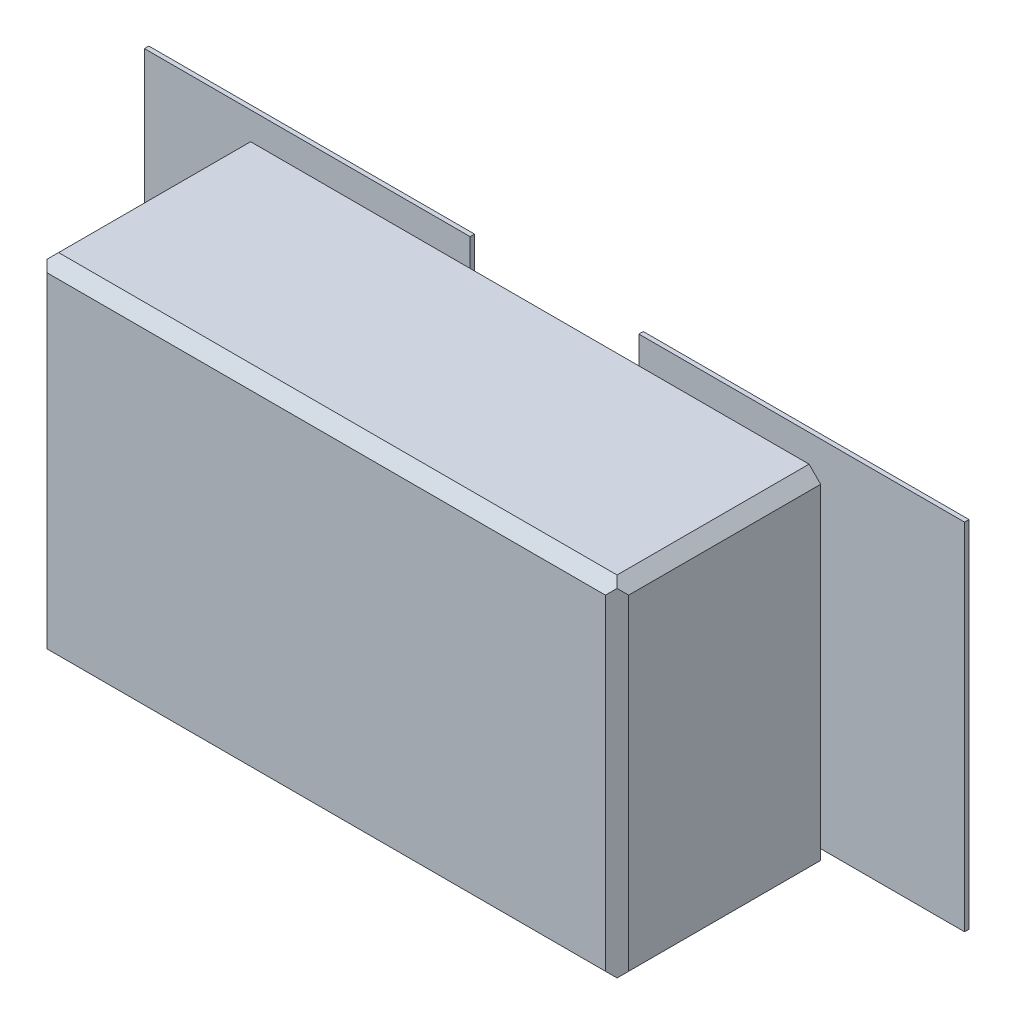
ISO-10303-21;
HEADER;
FILE_DESCRIPTION(('STEP AP214'),'2;1');
FILE_NAME('part.step','',(''),(''),'','','');
FILE_SCHEMA(('AUTOMOTIVE_DESIGN { 1 0 10303 214 1 1 1 1 }'));
ENDSEC;
DATA;
#1=APPLICATION_CONTEXT('core data for automotive mechanical design processes');
#2=APPLICATION_PROTOCOL_DEFINITION('international standard','automotive_design',2000,#1);
#3=PRODUCT_CONTEXT('',#1,'mechanical');
#4=PRODUCT('Part','Part','',(#3));
#5=PRODUCT_RELATED_PRODUCT_CATEGORY('part','',(#4));
#6=PRODUCT_DEFINITION_FORMATION('','',#4);
#7=PRODUCT_DEFINITION_CONTEXT('part definition',#1,'design');
#8=PRODUCT_DEFINITION('design','',#6,#7);
#9=PRODUCT_DEFINITION_SHAPE('','',#8);
#10=(LENGTH_UNIT() NAMED_UNIT(*) SI_UNIT(.MILLI.,.METRE.));
#11=(NAMED_UNIT(*) PLANE_ANGLE_UNIT() SI_UNIT($,.RADIAN.));
#12=(NAMED_UNIT(*) SI_UNIT($,.STERADIAN.) SOLID_ANGLE_UNIT());
#13=UNCERTAINTY_MEASURE_WITH_UNIT(LENGTH_MEASURE(1.E-05),#10,'distance_accuracy_value','');
#14=(GEOMETRIC_REPRESENTATION_CONTEXT(3) GLOBAL_UNCERTAINTY_ASSIGNED_CONTEXT((#13)) GLOBAL_UNIT_ASSIGNED_CONTEXT((#10,
#11,#12)) REPRESENTATION_CONTEXT('',''));
#15=CARTESIAN_POINT('',(0.,0.,0.));
#16=DIRECTION('',(0.,0.,1.));
#17=DIRECTION('',(1.,0.,0.));
#18=AXIS2_PLACEMENT_3D('',#15,#16,#17);
#19=CARTESIAN_POINT('',(0.,0.,0.08382));
#20=DIRECTION('',(0.,0.,1.));
#21=DIRECTION('',(1.,0.,0.));
#22=AXIS2_PLACEMENT_3D('',#19,#20,#21);
#23=PLANE('',#22);
#24=DIRECTION('',(0.,1.,0.));
#25=VECTOR('',#24,1.);
#26=CARTESIAN_POINT('',(0.145000000000004,0.30500000000005,0.08382));
#27=LINE('',#26,#25);
#28=CARTESIAN_POINT('',(0.145000000000004,-0.30500000000005,0.08382));
#29=VERTEX_POINT('',#28);
#30=CARTESIAN_POINT('',(0.145000000000004,0.30500000000005,0.08382));
#31=VERTEX_POINT('',#30);
#32=EDGE_CURVE('P0_E68',#29,#31,#27,.T.);
#33=ORIENTED_EDGE('',*,*,#32,.F.);
#34=DIRECTION('',(1.,0.,0.));
#35=VECTOR('',#34,1.);
#36=CARTESIAN_POINT('',(0.145000000000004,-0.30500000000005,0.08382));
#37=LINE('',#36,#35);
#38=CARTESIAN_POINT('',(0.704999999999974,-0.30500000000005,0.08382));
#39=VERTEX_POINT('',#38);
#40=EDGE_CURVE('P0_E20',#39,#29,#37,.F.);
#41=ORIENTED_EDGE('',*,*,#40,.F.);
#42=DIRECTION('',(0.,1.,0.));
#43=VECTOR('',#42,1.);
#44=CARTESIAN_POINT('',(0.704999999999974,-0.30500000000005,0.08382));
#45=LINE('',#44,#43);
#46=CARTESIAN_POINT('',(0.704999999999974,0.30500000000005,0.08382));
#47=VERTEX_POINT('',#46);
#48=EDGE_CURVE('P0_E58',#47,#39,#45,.F.);
#49=ORIENTED_EDGE('',*,*,#48,.F.);
#50=DIRECTION('',(1.,0.,0.));
#51=VECTOR('',#50,1.);
#52=CARTESIAN_POINT('',(0.704999999999974,0.30500000000005,0.08382));
#53=LINE('',#52,#51);
#54=EDGE_CURVE('P0_E53',#31,#47,#53,.T.);
#55=ORIENTED_EDGE('',*,*,#54,.F.);
#56=EDGE_LOOP('',(#33,#41,#49,#55));
#57=FACE_BOUND('',#56,.T.);
#58=ADVANCED_FACE('P0_F17',(#57),#23,.T.);
#59=CARTESIAN_POINT('',(0.145000000000004,-0.30500000000005,0.0762));
#60=DIRECTION('',(0.,-1.,0.));
#61=DIRECTION('',(0.,0.,-1.));
#62=AXIS2_PLACEMENT_3D('',#59,#60,#61);
#63=PLANE('',#62);
#64=DIRECTION('',(0.,0.,1.));
#65=VECTOR('',#64,1.);
#66=CARTESIAN_POINT('',(0.145000000000004,-0.30500000000005,0.0762));
#67=LINE('',#66,#65);
#68=CARTESIAN_POINT('',(0.145000000000004,-0.30500000000005,0.0762));
#69=VERTEX_POINT('',#68);
#70=EDGE_CURVE('P0_E79',#69,#29,#67,.T.);
#71=ORIENTED_EDGE('',*,*,#70,.F.);
#72=DIRECTION('',(1.,0.,0.));
#73=VECTOR('',#72,1.);
#74=CARTESIAN_POINT('',(0.,-0.30500000000005,0.0762));
#75=LINE('',#74,#73);
#76=CARTESIAN_POINT('',(0.704999999999974,-0.30500000000005,0.0762));
#77=VERTEX_POINT('',#76);
#78=EDGE_CURVE('P0_E74',#69,#77,#75,.T.);
#79=ORIENTED_EDGE('',*,*,#78,.T.);
#80=DIRECTION('',(0.,0.,-1.));
#81=VECTOR('',#80,1.);
#82=CARTESIAN_POINT('',(0.704999999999974,-0.30500000000005,0.0762));
#83=LINE('',#82,#81);
#84=EDGE_CURVE('P0_E63',#39,#77,#83,.T.);
#85=ORIENTED_EDGE('',*,*,#84,.F.);
#86=ORIENTED_EDGE('',*,*,#40,.T.);
#87=EDGE_LOOP('',(#71,#79,#85,#86));
#88=FACE_BOUND('',#87,.T.);
#89=ADVANCED_FACE('P0_F73',(#88),#63,.T.);
#90=CARTESIAN_POINT('',(0.704999999999974,-0.30500000000005,0.0762));
#91=DIRECTION('',(1.,0.,0.));
#92=DIRECTION('',(0.,0.,-1.));
#93=AXIS2_PLACEMENT_3D('',#90,#91,#92);
#94=PLANE('',#93);
#95=ORIENTED_EDGE('',*,*,#84,.T.);
#96=DIRECTION('',(0.,1.,0.));
#97=VECTOR('',#96,1.);
#98=CARTESIAN_POINT('',(0.704999999999974,0.,0.0762));
#99=LINE('',#98,#97);
#100=CARTESIAN_POINT('',(0.704999999999974,0.30500000000005,0.0762));
#101=VERTEX_POINT('',#100);
#102=EDGE_CURVE('P0_E84',#77,#101,#99,.T.);
#103=ORIENTED_EDGE('',*,*,#102,.T.);
#104=DIRECTION('',(0.,0.,1.));
#105=VECTOR('',#104,1.);
#106=CARTESIAN_POINT('',(0.704999999999974,0.30500000000005,0.0762));
#107=LINE('',#106,#105);
#108=EDGE_CURVE('P0_E65',#47,#101,#107,.F.);
#109=ORIENTED_EDGE('',*,*,#108,.F.);
#110=ORIENTED_EDGE('',*,*,#48,.T.);
#111=EDGE_LOOP('',(#95,#103,#109,#110));
#112=FACE_BOUND('',#111,.T.);
#113=ADVANCED_FACE('P0_F60',(#112),#94,.T.);
#114=CARTESIAN_POINT('',(0.704999999999974,0.30500000000005,0.0762));
#115=DIRECTION('',(0.,1.,0.));
#116=DIRECTION('',(0.,0.,1.));
#117=AXIS2_PLACEMENT_3D('',#114,#115,#116);
#118=PLANE('',#117);
#119=ORIENTED_EDGE('',*,*,#108,.T.);
#120=DIRECTION('',(1.,0.,0.));
#121=VECTOR('',#120,1.);
#122=CARTESIAN_POINT('',(0.,0.30500000000005,0.0762));
#123=LINE('',#122,#121);
#124=CARTESIAN_POINT('',(0.145000000000004,0.30500000000005,0.0762));
#125=VERTEX_POINT('',#124);
#126=EDGE_CURVE('P0_E26',#101,#125,#123,.F.);
#127=ORIENTED_EDGE('',*,*,#126,.T.);
#128=DIRECTION('',(0.,0.,1.));
#129=VECTOR('',#128,1.);
#130=CARTESIAN_POINT('',(0.145000000000004,0.30500000000005,0.0762));
#131=LINE('',#130,#129);
#132=EDGE_CURVE('P0_E34',#31,#125,#131,.F.);
#133=ORIENTED_EDGE('',*,*,#132,.F.);
#134=ORIENTED_EDGE('',*,*,#54,.T.);
#135=EDGE_LOOP('',(#119,#127,#133,#134));
#136=FACE_BOUND('',#135,.T.);
#137=ADVANCED_FACE('P0_F88',(#136),#118,.T.);
#138=CARTESIAN_POINT('',(0.145000000000004,0.30500000000005,0.0762));
#139=DIRECTION('',(-1.,0.,0.));
#140=DIRECTION('',(0.,0.,1.));
#141=AXIS2_PLACEMENT_3D('',#138,#139,#140);
#142=PLANE('',#141);
#143=ORIENTED_EDGE('',*,*,#132,.T.);
#144=DIRECTION('',(0.,1.,0.));
#145=VECTOR('',#144,1.);
#146=CARTESIAN_POINT('',(0.145000000000004,0.,0.0762));
#147=LINE('',#146,#145);
#148=EDGE_CURVE('P0_E11',#125,#69,#147,.F.);
#149=ORIENTED_EDGE('',*,*,#148,.T.);
#150=ORIENTED_EDGE('',*,*,#70,.T.);
#151=ORIENTED_EDGE('',*,*,#32,.T.);
#152=EDGE_LOOP('',(#143,#149,#150,#151));
#153=FACE_BOUND('',#152,.T.);
#154=ADVANCED_FACE('P0_F91',(#153),#142,.T.);
#155=CARTESIAN_POINT('',(0.,0.,0.0762));
#156=DIRECTION('',(0.,0.,1.));
#157=DIRECTION('',(1.,0.,0.));
#158=AXIS2_PLACEMENT_3D('',#155,#156,#157);
#159=PLANE('',#158);
#160=ORIENTED_EDGE('',*,*,#126,.F.);
#161=ORIENTED_EDGE('',*,*,#102,.F.);
#162=ORIENTED_EDGE('',*,*,#78,.F.);
#163=ORIENTED_EDGE('',*,*,#148,.F.);
#164=EDGE_LOOP('',(#160,#161,#162,#163));
#165=FACE_BOUND('',#164,.T.);
#166=ADVANCED_FACE('P0_F90',(#165),#159,.F.);
#167=CLOSED_SHELL('',(#58,#89,#113,#137,#154,#166));
#168=MANIFOLD_SOLID_BREP('P0_B1',#167);
#169=CARTESIAN_POINT('',(0.,0.,0.08382));
#170=DIRECTION('',(0.,0.,1.));
#171=DIRECTION('',(1.,0.,0.));
#172=AXIS2_PLACEMENT_3D('',#169,#170,#171);
#173=PLANE('',#172);
#174=DIRECTION('',(0.,1.,0.));
#175=VECTOR('',#174,1.);
#176=CARTESIAN_POINT('',(-0.704999999999974,0.30500000000005,0.08382));
#177=LINE('',#176,#175);
#178=CARTESIAN_POINT('',(-0.704999999999974,-0.30500000000005,0.08382));
#179=VERTEX_POINT('',#178);
#180=CARTESIAN_POINT('',(-0.704999999999974,0.30500000000005,0.08382));
#181=VERTEX_POINT('',#180);
#182=EDGE_CURVE('P1_E68',#179,#181,#177,.T.);
#183=ORIENTED_EDGE('',*,*,#182,.F.);
#184=DIRECTION('',(1.,0.,0.));
#185=VECTOR('',#184,1.);
#186=CARTESIAN_POINT('',(-0.704999999999974,-0.30500000000005,0.08382));
#187=LINE('',#186,#185);
#188=CARTESIAN_POINT('',(-0.145000000000004,-0.30500000000005,0.08382));
#189=VERTEX_POINT('',#188);
#190=EDGE_CURVE('P1_E20',#189,#179,#187,.F.);
#191=ORIENTED_EDGE('',*,*,#190,.F.);
#192=DIRECTION('',(0.,1.,0.));
#193=VECTOR('',#192,1.);
#194=CARTESIAN_POINT('',(-0.145000000000004,-0.30500000000005,0.08382));
#195=LINE('',#194,#193);
#196=CARTESIAN_POINT('',(-0.145000000000004,0.30500000000005,0.08382));
#197=VERTEX_POINT('',#196);
#198=EDGE_CURVE('P1_E58',#197,#189,#195,.F.);
#199=ORIENTED_EDGE('',*,*,#198,.F.);
#200=DIRECTION('',(1.,0.,0.));
#201=VECTOR('',#200,1.);
#202=CARTESIAN_POINT('',(-0.145000000000004,0.30500000000005,0.08382));
#203=LINE('',#202,#201);
#204=EDGE_CURVE('P1_E53',#181,#197,#203,.T.);
#205=ORIENTED_EDGE('',*,*,#204,.F.);
#206=EDGE_LOOP('',(#183,#191,#199,#205));
#207=FACE_BOUND('',#206,.T.);
#208=ADVANCED_FACE('P1_F17',(#207),#173,.T.);
#209=CARTESIAN_POINT('',(-0.704999999999974,-0.30500000000005,0.0762));
#210=DIRECTION('',(0.,-1.,0.));
#211=DIRECTION('',(0.,0.,-1.));
#212=AXIS2_PLACEMENT_3D('',#209,#210,#211);
#213=PLANE('',#212);
#214=DIRECTION('',(0.,0.,1.));
#215=VECTOR('',#214,1.);
#216=CARTESIAN_POINT('',(-0.704999999999974,-0.30500000000005,0.0762));
#217=LINE('',#216,#215);
#218=CARTESIAN_POINT('',(-0.704999999999974,-0.30500000000005,0.0762));
#219=VERTEX_POINT('',#218);
#220=EDGE_CURVE('P1_E79',#219,#179,#217,.T.);
#221=ORIENTED_EDGE('',*,*,#220,.F.);
#222=DIRECTION('',(1.,0.,0.));
#223=VECTOR('',#222,1.);
#224=CARTESIAN_POINT('',(0.,-0.30500000000005,0.0762));
#225=LINE('',#224,#223);
#226=CARTESIAN_POINT('',(-0.145000000000004,-0.30500000000005,0.0762));
#227=VERTEX_POINT('',#226);
#228=EDGE_CURVE('P1_E74',#219,#227,#225,.T.);
#229=ORIENTED_EDGE('',*,*,#228,.T.);
#230=DIRECTION('',(0.,0.,-1.));
#231=VECTOR('',#230,1.);
#232=CARTESIAN_POINT('',(-0.145000000000004,-0.30500000000005,0.0762));
#233=LINE('',#232,#231);
#234=EDGE_CURVE('P1_E63',#189,#227,#233,.T.);
#235=ORIENTED_EDGE('',*,*,#234,.F.);
#236=ORIENTED_EDGE('',*,*,#190,.T.);
#237=EDGE_LOOP('',(#221,#229,#235,#236));
#238=FACE_BOUND('',#237,.T.);
#239=ADVANCED_FACE('P1_F73',(#238),#213,.T.);
#240=CARTESIAN_POINT('',(-0.145000000000004,-0.30500000000005,0.0762));
#241=DIRECTION('',(1.,0.,0.));
#242=DIRECTION('',(0.,0.,-1.));
#243=AXIS2_PLACEMENT_3D('',#240,#241,#242);
#244=PLANE('',#243);
#245=ORIENTED_EDGE('',*,*,#234,.T.);
#246=DIRECTION('',(0.,1.,0.));
#247=VECTOR('',#246,1.);
#248=CARTESIAN_POINT('',(-0.145000000000004,0.,0.0762));
#249=LINE('',#248,#247);
#250=CARTESIAN_POINT('',(-0.145000000000004,0.30500000000005,0.0762));
#251=VERTEX_POINT('',#250);
#252=EDGE_CURVE('P1_E84',#227,#251,#249,.T.);
#253=ORIENTED_EDGE('',*,*,#252,.T.);
#254=DIRECTION('',(0.,0.,1.));
#255=VECTOR('',#254,1.);
#256=CARTESIAN_POINT('',(-0.145000000000004,0.30500000000005,0.0762));
#257=LINE('',#256,#255);
#258=EDGE_CURVE('P1_E65',#197,#251,#257,.F.);
#259=ORIENTED_EDGE('',*,*,#258,.F.);
#260=ORIENTED_EDGE('',*,*,#198,.T.);
#261=EDGE_LOOP('',(#245,#253,#259,#260));
#262=FACE_BOUND('',#261,.T.);
#263=ADVANCED_FACE('P1_F60',(#262),#244,.T.);
#264=CARTESIAN_POINT('',(-0.145000000000004,0.30500000000005,0.0762));
#265=DIRECTION('',(0.,1.,0.));
#266=DIRECTION('',(0.,0.,1.));
#267=AXIS2_PLACEMENT_3D('',#264,#265,#266);
#268=PLANE('',#267);
#269=ORIENTED_EDGE('',*,*,#258,.T.);
#270=DIRECTION('',(1.,0.,0.));
#271=VECTOR('',#270,1.);
#272=CARTESIAN_POINT('',(0.,0.30500000000005,0.0762));
#273=LINE('',#272,#271);
#274=CARTESIAN_POINT('',(-0.704999999999974,0.30500000000005,0.0762));
#275=VERTEX_POINT('',#274);
#276=EDGE_CURVE('P1_E26',#251,#275,#273,.F.);
#277=ORIENTED_EDGE('',*,*,#276,.T.);
#278=DIRECTION('',(0.,0.,1.));
#279=VECTOR('',#278,1.);
#280=CARTESIAN_POINT('',(-0.704999999999974,0.30500000000005,0.0762));
#281=LINE('',#280,#279);
#282=EDGE_CURVE('P1_E34',#181,#275,#281,.F.);
#283=ORIENTED_EDGE('',*,*,#282,.F.);
#284=ORIENTED_EDGE('',*,*,#204,.T.);
#285=EDGE_LOOP('',(#269,#277,#283,#284));
#286=FACE_BOUND('',#285,.T.);
#287=ADVANCED_FACE('P1_F88',(#286),#268,.T.);
#288=CARTESIAN_POINT('',(-0.704999999999974,0.30500000000005,0.0762));
#289=DIRECTION('',(-1.,0.,0.));
#290=DIRECTION('',(0.,0.,1.));
#291=AXIS2_PLACEMENT_3D('',#288,#289,#290);
#292=PLANE('',#291);
#293=ORIENTED_EDGE('',*,*,#282,.T.);
#294=DIRECTION('',(0.,1.,0.));
#295=VECTOR('',#294,1.);
#296=CARTESIAN_POINT('',(-0.704999999999974,0.,0.0762));
#297=LINE('',#296,#295);
#298=EDGE_CURVE('P1_E11',#275,#219,#297,.F.);
#299=ORIENTED_EDGE('',*,*,#298,.T.);
#300=ORIENTED_EDGE('',*,*,#220,.T.);
#301=ORIENTED_EDGE('',*,*,#182,.T.);
#302=EDGE_LOOP('',(#293,#299,#300,#301));
#303=FACE_BOUND('',#302,.T.);
#304=ADVANCED_FACE('P1_F91',(#303),#292,.T.);
#305=CARTESIAN_POINT('',(0.,0.,0.0762));
#306=DIRECTION('',(0.,0.,1.));
#307=DIRECTION('',(1.,0.,0.));
#308=AXIS2_PLACEMENT_3D('',#305,#306,#307);
#309=PLANE('',#308);
#310=ORIENTED_EDGE('',*,*,#276,.F.);
#311=ORIENTED_EDGE('',*,*,#252,.F.);
#312=ORIENTED_EDGE('',*,*,#228,.F.);
#313=ORIENTED_EDGE('',*,*,#298,.F.);
#314=EDGE_LOOP('',(#310,#311,#312,#313));
#315=FACE_BOUND('',#314,.T.);
#316=ADVANCED_FACE('P1_F90',(#315),#309,.F.);
#317=CLOSED_SHELL('',(#208,#239,#263,#287,#304,#316));
#318=MANIFOLD_SOLID_BREP('P1_B1',#317);
#319=CARTESIAN_POINT('',(0.,0.,0.0862000000000108));
#320=DIRECTION('',(0.,0.,-1.));
#321=DIRECTION('',(-1.,0.,0.));
#322=AXIS2_PLACEMENT_3D('',#319,#320,#321);
#323=PLANE('',#322);
#324=DIRECTION('',(1.,0.,0.));
#325=VECTOR('',#324,1.);
#326=CARTESIAN_POINT('',(-0.415997395786882,0.249999999999991,0.0862000000000108));
#327=LINE('',#326,#325);
#328=CARTESIAN_POINT('',(-0.215997395786768,0.249999999999991,0.0862000000000108));
#329=VERTEX_POINT('',#328);
#330=CARTESIAN_POINT('',(-0.41599739578678,0.249999999999991,0.0862000000000108));
#331=VERTEX_POINT('',#330);
#332=EDGE_CURVE('P2_E184',#329,#331,#327,.F.);
#333=ORIENTED_EDGE('',*,*,#332,.F.);
#334=DIRECTION('',(0.,1.,0.));
#335=VECTOR('',#334,1.);
#336=CARTESIAN_POINT('',(-0.215997395786768,0.249999999999991,0.0862000000000108));
#337=LINE('',#336,#335);
#338=CARTESIAN_POINT('',(-0.215997395786768,-0.249999999999991,0.0862000000000108));
#339=VERTEX_POINT('',#338);
#340=EDGE_CURVE('P2_E212',#339,#329,#337,.T.);
#341=ORIENTED_EDGE('',*,*,#340,.F.);
#342=DIRECTION('',(1.,0.,0.));
#343=VECTOR('',#342,1.);
#344=CARTESIAN_POINT('',(-0.215997395786768,-0.249999999999991,0.0862000000000108));
#345=LINE('',#344,#343);
#346=CARTESIAN_POINT('',(-0.465997395786682,-0.249999999999991,0.0862000000000108));
#347=VERTEX_POINT('',#346);
#348=EDGE_CURVE('P2_E163',#347,#339,#345,.T.);
#349=ORIENTED_EDGE('',*,*,#348,.F.);
#350=DIRECTION('',(0.,1.,0.));
#351=VECTOR('',#350,1.);
#352=CARTESIAN_POINT('',(-0.465997395786682,-0.249999999999991,0.0862000000000108));
#353=LINE('',#352,#351);
#354=CARTESIAN_POINT('',(-0.465997395786682,0.199999999999987,0.0862000000000108));
#355=VERTEX_POINT('',#354);
#356=EDGE_CURVE('P2_E157',#355,#347,#353,.F.);
#357=ORIENTED_EDGE('',*,*,#356,.F.);
#358=CARTESIAN_POINT('',(-0.465997395786682,0.249999999999991,0.0862000000000108));
#359=DIRECTION('',(0.,0.,-1.));
#360=DIRECTION('',(-1.,0.,0.));
#361=AXIS2_PLACEMENT_3D('',#358,#359,#360);
#362=CIRCLE('',#361,0.0500000000000032);
#363=EDGE_CURVE('P2_E20',#355,#331,#362,.F.);
#364=ORIENTED_EDGE('',*,*,#363,.T.);
#365=EDGE_LOOP('',(#333,#341,#349,#357,#364));
#366=FACE_BOUND('',#365,.T.);
#367=ADVANCED_FACE('P2_F17',(#366),#323,.T.);
#368=CARTESIAN_POINT('',(0.,0.,0.0862000000000108));
#369=DIRECTION('',(0.,0.,-1.));
#370=DIRECTION('',(-1.,0.,0.));
#371=AXIS2_PLACEMENT_3D('',#368,#369,#370);
#372=PLANE('',#371);
#373=DIRECTION('',(1.,0.,0.));
#374=VECTOR('',#373,1.);
#375=CARTESIAN_POINT('',(0.184002604213233,0.249999999999991,0.0862000000000108));
#376=LINE('',#375,#374);
#377=CARTESIAN_POINT('',(0.434002604213274,0.249999999999991,0.0862000000000108));
#378=VERTEX_POINT('',#377);
#379=CARTESIAN_POINT('',(0.184002604213233,0.249999999999991,0.0862000000000108));
#380=VERTEX_POINT('',#379);
#381=EDGE_CURVE('P2_E232',#378,#380,#376,.F.);
#382=ORIENTED_EDGE('',*,*,#381,.F.);
#383=DIRECTION('',(0.,1.,0.));
#384=VECTOR('',#383,1.);
#385=CARTESIAN_POINT('',(0.434002604213274,0.249999999999991,0.0862000000000108));
#386=LINE('',#385,#384);
#387=CARTESIAN_POINT('',(0.434002604213274,-0.249999999999991,0.0862000000000108));
#388=VERTEX_POINT('',#387);
#389=EDGE_CURVE('P2_E249',#388,#378,#386,.T.);
#390=ORIENTED_EDGE('',*,*,#389,.F.);
#391=DIRECTION('',(1.,0.,0.));
#392=VECTOR('',#391,1.);
#393=CARTESIAN_POINT('',(0.434002604213274,-0.249999999999991,0.0862000000000108));
#394=LINE('',#393,#392);
#395=CARTESIAN_POINT('',(0.184002604213233,-0.249999999999991,0.0862000000000108));
#396=VERTEX_POINT('',#395);
#397=EDGE_CURVE('P2_E247',#396,#388,#394,.T.);
#398=ORIENTED_EDGE('',*,*,#397,.F.);
#399=DIRECTION('',(0.,1.,0.));
#400=VECTOR('',#399,1.);
#401=CARTESIAN_POINT('',(0.184002604213233,-0.249999999999991,0.0862000000000108));
#402=LINE('',#401,#400);
#403=EDGE_CURVE('P2_E241',#380,#396,#402,.F.);
#404=ORIENTED_EDGE('',*,*,#403,.F.);
#405=EDGE_LOOP('',(#382,#390,#398,#404));
#406=FACE_BOUND('',#405,.T.);
#407=ADVANCED_FACE('P2_F273',(#406),#372,.T.);
#408=CARTESIAN_POINT('',(-0.215997395786768,0.249999999999991,0.126200000000003));
#409=DIRECTION('',(1.,0.,0.));
#410=DIRECTION('',(0.,0.,-1.));
#411=AXIS2_PLACEMENT_3D('',#408,#409,#410);
#412=PLANE('',#411);
#413=DIRECTION('',(0.,0.,1.));
#414=VECTOR('',#413,1.);
#415=CARTESIAN_POINT('',(-0.215997395786768,0.249999999999991,0.126200000000003));
#416=LINE('',#415,#414);
#417=CARTESIAN_POINT('',(-0.215997395786768,0.249999999999991,0.126200000000003));
#418=VERTEX_POINT('',#417);
#419=EDGE_CURVE('P2_E182',#418,#329,#416,.F.);
#420=ORIENTED_EDGE('',*,*,#419,.F.);
#421=DIRECTION('',(0.,1.,0.));
#422=VECTOR('',#421,1.);
#423=CARTESIAN_POINT('',(-0.215997395786768,0.,0.126200000000003));
#424=LINE('',#423,#422);
#425=CARTESIAN_POINT('',(-0.215997395786768,-0.249999999999991,0.126200000000003));
#426=VERTEX_POINT('',#425);
#427=EDGE_CURVE('P2_E194',#418,#426,#424,.F.);
#428=ORIENTED_EDGE('',*,*,#427,.T.);
#429=DIRECTION('',(0.,0.,-1.));
#430=VECTOR('',#429,1.);
#431=CARTESIAN_POINT('',(-0.215997395786768,-0.249999999999991,0.126200000000003));
#432=LINE('',#431,#430);
#433=EDGE_CURVE('P2_E168',#339,#426,#432,.F.);
#434=ORIENTED_EDGE('',*,*,#433,.F.);
#435=ORIENTED_EDGE('',*,*,#340,.T.);
#436=EDGE_LOOP('',(#420,#428,#434,#435));
#437=FACE_BOUND('',#436,.T.);
#438=ADVANCED_FACE('P2_F262',(#437),#412,.T.);
#439=CARTESIAN_POINT('',(-0.215997395786768,-0.249999999999991,0.126200000000003));
#440=DIRECTION('',(0.,-1.,0.));
#441=DIRECTION('',(0.,0.,-1.));
#442=AXIS2_PLACEMENT_3D('',#439,#440,#441);
#443=PLANE('',#442);
#444=ORIENTED_EDGE('',*,*,#433,.T.);
#445=DIRECTION('',(1.,0.,0.));
#446=VECTOR('',#445,1.);
#447=CARTESIAN_POINT('',(0.,-0.249999999999991,0.126200000000003));
#448=LINE('',#447,#446);
#449=CARTESIAN_POINT('',(-0.465997395786682,-0.249999999999991,0.126200000000003));
#450=VERTEX_POINT('',#449);
#451=EDGE_CURVE('P2_E196',#426,#450,#448,.F.);
#452=ORIENTED_EDGE('',*,*,#451,.T.);
#453=DIRECTION('',(0.,0.,1.));
#454=VECTOR('',#453,1.);
#455=CARTESIAN_POINT('',(-0.465997395786682,-0.249999999999991,0.126200000000003));
#456=LINE('',#455,#454);
#457=EDGE_CURVE('P2_E167',#347,#450,#456,.T.);
#458=ORIENTED_EDGE('',*,*,#457,.F.);
#459=ORIENTED_EDGE('',*,*,#348,.T.);
#460=EDGE_LOOP('',(#444,#452,#458,#459));
#461=FACE_BOUND('',#460,.T.);
#462=ADVANCED_FACE('P2_F264',(#461),#443,.T.);
#463=CARTESIAN_POINT('',(-0.465997395786682,-0.249999999999991,0.126200000000003));
#464=DIRECTION('',(-1.,0.,0.));
#465=DIRECTION('',(0.,0.,1.));
#466=AXIS2_PLACEMENT_3D('',#463,#464,#465);
#467=PLANE('',#466);
#468=ORIENTED_EDGE('',*,*,#457,.T.);
#469=DIRECTION('',(0.,1.,0.));
#470=VECTOR('',#469,1.);
#471=CARTESIAN_POINT('',(-0.465997395786682,0.,0.126200000000003));
#472=LINE('',#471,#470);
#473=CARTESIAN_POINT('',(-0.465997395786682,0.199999999999987,0.126200000000003));
#474=VERTEX_POINT('',#473);
#475=EDGE_CURVE('P2_E174',#450,#474,#472,.T.);
#476=ORIENTED_EDGE('',*,*,#475,.T.);
#477=DIRECTION('',(0.,0.,-1.));
#478=VECTOR('',#477,1.);
#479=CARTESIAN_POINT('',(-0.465997395786682,0.199999999999987,0.126200000000003));
#480=LINE('',#479,#478);
#481=EDGE_CURVE('P2_E171',#474,#355,#480,.T.);
#482=ORIENTED_EDGE('',*,*,#481,.T.);
#483=ORIENTED_EDGE('',*,*,#356,.T.);
#484=EDGE_LOOP('',(#468,#476,#482,#483));
#485=FACE_BOUND('',#484,.T.);
#486=ADVANCED_FACE('P2_F172',(#485),#467,.T.);
#487=CARTESIAN_POINT('',(-0.465997395786682,0.249999999999991,0.126200000000003));
#488=DIRECTION('',(0.,0.,-1.));
#489=DIRECTION('',(-1.,0.,0.));
#490=AXIS2_PLACEMENT_3D('',#487,#488,#489);
#491=CYLINDRICAL_SURFACE('',#490,0.0500000000000032);
#492=ORIENTED_EDGE('',*,*,#363,.F.);
#493=ORIENTED_EDGE('',*,*,#481,.F.);
#494=CARTESIAN_POINT('',(-0.465997395786682,0.249999999999991,0.126200000000003));
#495=DIRECTION('',(0.,0.,-1.));
#496=DIRECTION('',(-1.,0.,0.));
#497=AXIS2_PLACEMENT_3D('',#494,#495,#496);
#498=CIRCLE('',#497,0.0500000000000032);
#499=CARTESIAN_POINT('',(-0.41599739578678,0.249999999999991,0.126200000000003));
#500=VERTEX_POINT('',#499);
#501=EDGE_CURVE('P2_E220',#474,#500,#498,.F.);
#502=ORIENTED_EDGE('',*,*,#501,.T.);
#503=DIRECTION('',(0.,0.,1.));
#504=VECTOR('',#503,1.);
#505=CARTESIAN_POINT('',(-0.415997395786882,0.249999999999991,0.126200000000003));
#506=LINE('',#505,#504);
#507=EDGE_CURVE('P2_E180',#331,#500,#506,.T.);
#508=ORIENTED_EDGE('',*,*,#507,.F.);
#509=EDGE_LOOP('',(#492,#493,#502,#508));
#510=FACE_BOUND('',#509,.T.);
#511=ADVANCED_FACE('P2_F178',(#510),#491,.F.);
#512=CARTESIAN_POINT('',(-0.415997395786882,0.249999999999991,0.126200000000003));
#513=DIRECTION('',(0.,1.,0.));
#514=DIRECTION('',(0.,0.,1.));
#515=AXIS2_PLACEMENT_3D('',#512,#513,#514);
#516=PLANE('',#515);
#517=ORIENTED_EDGE('',*,*,#507,.T.);
#518=DIRECTION('',(1.,0.,0.));
#519=VECTOR('',#518,1.);
#520=CARTESIAN_POINT('',(0.,0.249999999999991,0.126200000000003));
#521=LINE('',#520,#519);
#522=EDGE_CURVE('P2_E221',#500,#418,#521,.T.);
#523=ORIENTED_EDGE('',*,*,#522,.T.);
#524=ORIENTED_EDGE('',*,*,#419,.T.);
#525=ORIENTED_EDGE('',*,*,#332,.T.);
#526=EDGE_LOOP('',(#517,#523,#524,#525));
#527=FACE_BOUND('',#526,.T.);
#528=ADVANCED_FACE('P2_F254',(#527),#516,.T.);
#529=CARTESIAN_POINT('',(0.434002604213274,0.249999999999991,0.126200000000003));
#530=DIRECTION('',(1.,0.,0.));
#531=DIRECTION('',(0.,0.,-1.));
#532=AXIS2_PLACEMENT_3D('',#529,#530,#531);
#533=PLANE('',#532);
#534=DIRECTION('',(0.,0.,1.));
#535=VECTOR('',#534,1.);
#536=CARTESIAN_POINT('',(0.434002604213274,0.249999999999991,0.126200000000003));
#537=LINE('',#536,#535);
#538=CARTESIAN_POINT('',(0.434002604213274,0.249999999999991,0.126200000000003));
#539=VERTEX_POINT('',#538);
#540=EDGE_CURVE('P2_E235',#539,#378,#537,.F.);
#541=ORIENTED_EDGE('',*,*,#540,.F.);
#542=DIRECTION('',(0.,1.,0.));
#543=VECTOR('',#542,1.);
#544=CARTESIAN_POINT('',(0.434002604213274,0.,0.126200000000003));
#545=LINE('',#544,#543);
#546=CARTESIAN_POINT('',(0.434002604213274,-0.249999999999991,0.126200000000003));
#547=VERTEX_POINT('',#546);
#548=EDGE_CURVE('P2_E222',#539,#547,#545,.F.);
#549=ORIENTED_EDGE('',*,*,#548,.T.);
#550=DIRECTION('',(0.,0.,-1.));
#551=VECTOR('',#550,1.);
#552=CARTESIAN_POINT('',(0.434002604213274,-0.249999999999991,0.126200000000003));
#553=LINE('',#552,#551);
#554=EDGE_CURVE('P2_E244',#388,#547,#553,.F.);
#555=ORIENTED_EDGE('',*,*,#554,.F.);
#556=ORIENTED_EDGE('',*,*,#389,.T.);
#557=EDGE_LOOP('',(#541,#549,#555,#556));
#558=FACE_BOUND('',#557,.T.);
#559=ADVANCED_FACE('P2_F344',(#558),#533,.T.);
#560=CARTESIAN_POINT('',(0.434002604213274,-0.249999999999991,0.126200000000003));
#561=DIRECTION('',(0.,-1.,0.));
#562=DIRECTION('',(0.,0.,-1.));
#563=AXIS2_PLACEMENT_3D('',#560,#561,#562);
#564=PLANE('',#563);
#565=ORIENTED_EDGE('',*,*,#554,.T.);
#566=DIRECTION('',(1.,0.,0.));
#567=VECTOR('',#566,1.);
#568=CARTESIAN_POINT('',(0.,-0.249999999999991,0.126200000000003));
#569=LINE('',#568,#567);
#570=CARTESIAN_POINT('',(0.184002604213233,-0.249999999999991,0.126200000000003));
#571=VERTEX_POINT('',#570);
#572=EDGE_CURVE('P2_E513',#547,#571,#569,.F.);
#573=ORIENTED_EDGE('',*,*,#572,.T.);
#574=DIRECTION('',(0.,0.,1.));
#575=VECTOR('',#574,1.);
#576=CARTESIAN_POINT('',(0.184002604213233,-0.249999999999991,0.126200000000003));
#577=LINE('',#576,#575);
#578=EDGE_CURVE('P2_E238',#396,#571,#577,.T.);
#579=ORIENTED_EDGE('',*,*,#578,.F.);
#580=ORIENTED_EDGE('',*,*,#397,.T.);
#581=EDGE_LOOP('',(#565,#573,#579,#580));
#582=FACE_BOUND('',#581,.T.);
#583=ADVANCED_FACE('P2_F340',(#582),#564,.T.);
#584=CARTESIAN_POINT('',(0.184002604213233,-0.249999999999991,0.126200000000003));
#585=DIRECTION('',(-1.,0.,0.));
#586=DIRECTION('',(0.,0.,1.));
#587=AXIS2_PLACEMENT_3D('',#584,#585,#586);
#588=PLANE('',#587);
#589=ORIENTED_EDGE('',*,*,#578,.T.);
#590=DIRECTION('',(0.,1.,0.));
#591=VECTOR('',#590,1.);
#592=CARTESIAN_POINT('',(0.184002604213233,0.,0.126200000000003));
#593=LINE('',#592,#591);
#594=CARTESIAN_POINT('',(0.184002604213233,0.249999999999991,0.126200000000003));
#595=VERTEX_POINT('',#594);
#596=EDGE_CURVE('P2_E517',#571,#595,#593,.T.);
#597=ORIENTED_EDGE('',*,*,#596,.T.);
#598=DIRECTION('',(0.,0.,1.));
#599=VECTOR('',#598,1.);
#600=CARTESIAN_POINT('',(0.184002604213233,0.249999999999991,0.126200000000003));
#601=LINE('',#600,#599);
#602=EDGE_CURVE('P2_E197',#380,#595,#601,.T.);
#603=ORIENTED_EDGE('',*,*,#602,.F.);
#604=ORIENTED_EDGE('',*,*,#403,.T.);
#605=EDGE_LOOP('',(#589,#597,#603,#604));
#606=FACE_BOUND('',#605,.T.);
#607=ADVANCED_FACE('P2_F336',(#606),#588,.T.);
#608=CARTESIAN_POINT('',(0.184002604213233,0.249999999999991,0.126200000000003));
#609=DIRECTION('',(0.,1.,0.));
#610=DIRECTION('',(0.,0.,1.));
#611=AXIS2_PLACEMENT_3D('',#608,#609,#610);
#612=PLANE('',#611);
#613=ORIENTED_EDGE('',*,*,#602,.T.);
#614=DIRECTION('',(1.,0.,0.));
#615=VECTOR('',#614,1.);
#616=CARTESIAN_POINT('',(0.,0.249999999999991,0.126200000000003));
#617=LINE('',#616,#615);
#618=EDGE_CURVE('P2_E510',#595,#539,#617,.T.);
#619=ORIENTED_EDGE('',*,*,#618,.T.);
#620=ORIENTED_EDGE('',*,*,#540,.T.);
#621=ORIENTED_EDGE('',*,*,#381,.T.);
#622=EDGE_LOOP('',(#613,#619,#620,#621));
#623=FACE_BOUND('',#622,.T.);
#624=ADVANCED_FACE('P2_F332',(#623),#612,.T.);
#625=CARTESIAN_POINT('',(0.,0.,0.126200000000003));
#626=DIRECTION('',(0.,0.,1.));
#627=DIRECTION('',(1.,0.,0.));
#628=AXIS2_PLACEMENT_3D('',#625,#626,#627);
#629=PLANE('',#628);
#630=ORIENTED_EDGE('',*,*,#596,.F.);
#631=ORIENTED_EDGE('',*,*,#572,.F.);
#632=ORIENTED_EDGE('',*,*,#548,.F.);
#633=ORIENTED_EDGE('',*,*,#618,.F.);
#634=EDGE_LOOP('',(#630,#631,#632,#633));
#635=FACE_BOUND('',#634,.T.);
#636=ORIENTED_EDGE('',*,*,#501,.F.);
#637=ORIENTED_EDGE('',*,*,#475,.F.);
#638=ORIENTED_EDGE('',*,*,#451,.F.);
#639=ORIENTED_EDGE('',*,*,#427,.F.);
#640=ORIENTED_EDGE('',*,*,#522,.F.);
#641=EDGE_LOOP('',(#636,#637,#638,#639,#640));
#642=FACE_BOUND('',#641,.T.);
#643=DIRECTION('',(0.707106781186548,0.707106781186548,0.));
#644=VECTOR('',#643,1.);
#645=CARTESIAN_POINT('',(0.490000000000072,-0.29000000000011,0.126200000000003));
#646=LINE('',#645,#644);
#647=CARTESIAN_POINT('',(0.480000000000112,-0.30000000000007,0.126200000000003));
#648=VERTEX_POINT('',#647);
#649=CARTESIAN_POINT('',(0.500000000000095,-0.27999999999996,0.126200000000003));
#650=VERTEX_POINT('',#649);
#651=EDGE_CURVE('P2_E552',#648,#650,#646,.T.);
#652=ORIENTED_EDGE('',*,*,#651,.F.);
#653=DIRECTION('',(1.,0.,0.));
#654=VECTOR('',#653,1.);
#655=CARTESIAN_POINT('',(-0.500000000000032,-0.30000000000007,0.126200000000003));
#656=LINE('',#655,#654);
#657=CARTESIAN_POINT('',(-0.480000000000112,-0.30000000000007,0.126200000000003));
#658=VERTEX_POINT('',#657);
#659=EDGE_CURVE('P2_E542',#658,#648,#656,.T.);
#660=ORIENTED_EDGE('',*,*,#659,.F.);
#661=DIRECTION('',(0.707106781186548,-0.707106781186548,0.));
#662=VECTOR('',#661,1.);
#663=CARTESIAN_POINT('',(-0.490000000000072,-0.29000000000011,0.126200000000003));
#664=LINE('',#663,#662);
#665=CARTESIAN_POINT('',(-0.500000000000064,-0.279999999999928,0.126200000000003));
#666=VERTEX_POINT('',#665);
#667=EDGE_CURVE('P2_E537',#666,#658,#664,.T.);
#668=ORIENTED_EDGE('',*,*,#667,.F.);
#669=DIRECTION('',(0.,1.,0.));
#670=VECTOR('',#669,1.);
#671=CARTESIAN_POINT('',(-0.500000000000032,0.30000000000007,0.126200000000003));
#672=LINE('',#671,#670);
#673=CARTESIAN_POINT('',(-0.500000000000095,0.27999999999996,0.126200000000003));
#674=VERTEX_POINT('',#673);
#675=EDGE_CURVE('P2_E532',#674,#666,#672,.F.);
#676=ORIENTED_EDGE('',*,*,#675,.F.);
#677=DIRECTION('',(-0.707106781186548,-0.707106781186548,0.));
#678=VECTOR('',#677,1.);
#679=CARTESIAN_POINT('',(-0.490000000000072,0.29000000000011,0.126200000000003));
#680=LINE('',#679,#678);
#681=CARTESIAN_POINT('',(-0.480000000000112,0.30000000000007,0.126200000000003));
#682=VERTEX_POINT('',#681);
#683=EDGE_CURVE('P2_E527',#682,#674,#680,.T.);
#684=ORIENTED_EDGE('',*,*,#683,.F.);
#685=DIRECTION('',(1.,0.,0.));
#686=VECTOR('',#685,1.);
#687=CARTESIAN_POINT('',(0.500000000000032,0.30000000000007,0.126200000000003));
#688=LINE('',#687,#686);
#689=CARTESIAN_POINT('',(0.480000000000112,0.30000000000007,0.126200000000003));
#690=VERTEX_POINT('',#689);
#691=EDGE_CURVE('P2_E522',#690,#682,#688,.F.);
#692=ORIENTED_EDGE('',*,*,#691,.F.);
#693=DIRECTION('',(-0.707106781186548,0.707106781186548,0.));
#694=VECTOR('',#693,1.);
#695=CARTESIAN_POINT('',(0.490000000000072,0.29000000000011,0.126200000000003));
#696=LINE('',#695,#694);
#697=CARTESIAN_POINT('',(0.500000000000064,0.279999999999928,0.126200000000003));
#698=VERTEX_POINT('',#697);
#699=EDGE_CURVE('P2_E546',#698,#690,#696,.T.);
#700=ORIENTED_EDGE('',*,*,#699,.F.);
#701=DIRECTION('',(0.,1.,0.));
#702=VECTOR('',#701,1.);
#703=CARTESIAN_POINT('',(0.500000000000032,-0.30000000000007,0.126200000000003));
#704=LINE('',#703,#702);
#705=EDGE_CURVE('P2_E557',#650,#698,#704,.T.);
#706=ORIENTED_EDGE('',*,*,#705,.F.);
#707=EDGE_LOOP('',(#652,#660,#668,#676,#684,#692,#700,#706));
#708=FACE_BOUND('',#707,.T.);
#709=ADVANCED_FACE('P2_F257',(#635,#642,#708),#629,.F.);
#710=CARTESIAN_POINT('',(0.500000000000032,0.30000000000007,0.0762));
#711=DIRECTION('',(0.,1.,0.));
#712=DIRECTION('',(0.,0.,1.));
#713=AXIS2_PLACEMENT_3D('',#710,#711,#712);
#714=PLANE('',#713);
#715=DIRECTION('',(1.,0.,0.));
#716=VECTOR('',#715,1.);
#717=CARTESIAN_POINT('',(0.,0.30000000000007,0.45625000000008));
#718=LINE('',#717,#716);
#719=CARTESIAN_POINT('',(0.480000000000112,0.30000000000007,0.45625000000008));
#720=VERTEX_POINT('',#719);
#721=CARTESIAN_POINT('',(-0.480000000000112,0.30000000000007,0.45625000000008));
#722=VERTEX_POINT('',#721);
#723=EDGE_CURVE('P2_E566',#720,#722,#718,.F.);
#724=ORIENTED_EDGE('',*,*,#723,.F.);
#725=DIRECTION('',(0.,0.,1.));
#726=VECTOR('',#725,1.);
#727=CARTESIAN_POINT('',(0.480000000000112,0.30000000000007,0.3012249999999));
#728=LINE('',#727,#726);
#729=EDGE_CURVE('P2_E544',#690,#720,#728,.T.);
#730=ORIENTED_EDGE('',*,*,#729,.F.);
#731=ORIENTED_EDGE('',*,*,#691,.T.);
#732=DIRECTION('',(0.,0.,1.));
#733=VECTOR('',#732,1.);
#734=CARTESIAN_POINT('',(-0.480000000000112,0.30000000000007,0.3012249999999));
#735=LINE('',#734,#733);
#736=EDGE_CURVE('P2_E524',#722,#682,#735,.F.);
#737=ORIENTED_EDGE('',*,*,#736,.F.);
#738=EDGE_LOOP('',(#724,#730,#731,#737));
#739=FACE_BOUND('',#738,.T.);
#740=ADVANCED_FACE('P2_F325',(#739),#714,.T.);
#741=CARTESIAN_POINT('',(-0.490000000000072,0.29000000000011,0.3012249999999));
#742=DIRECTION('',(-0.707106781186548,0.707106781186548,0.));
#743=DIRECTION('',(-0.707106781186548,-0.707106781186548,0.));
#744=AXIS2_PLACEMENT_3D('',#741,#742,#743);
#745=PLANE('',#744);
#746=ORIENTED_EDGE('',*,*,#736,.T.);
#747=ORIENTED_EDGE('',*,*,#683,.T.);
#748=DIRECTION('',(0.,0.,1.));
#749=VECTOR('',#748,1.);
#750=CARTESIAN_POINT('',(-0.500000000000032,0.279999999999896,0.0762));
#751=LINE('',#750,#749);
#752=CARTESIAN_POINT('',(-0.500000000000095,0.27999999999996,0.45625000000008));
#753=VERTEX_POINT('',#752);
#754=EDGE_CURVE('P2_E529',#753,#674,#751,.F.);
#755=ORIENTED_EDGE('',*,*,#754,.F.);
#756=DIRECTION('',(-0.577350269184738,-0.577350269199401,-0.577350269184738));
#757=VECTOR('',#756,1.);
#758=CARTESIAN_POINT('',(-0.490000000000072,0.29000000000011,0.46625000000004));
#759=LINE('',#758,#757);
#760=CARTESIAN_POINT('',(-0.490000000000072,0.29000000000011,0.46625000000004));
#761=VERTEX_POINT('',#760);
#762=EDGE_CURVE('P2_E576',#761,#753,#759,.T.);
#763=ORIENTED_EDGE('',*,*,#762,.F.);
#764=DIRECTION('',(-0.577350269189626,-0.577350269189626,0.577350269189626));
#765=VECTOR('',#764,1.);
#766=CARTESIAN_POINT('',(-0.480000000000112,0.30000000000007,0.45625000000008));
#767=LINE('',#766,#765);
#768=EDGE_CURVE('P2_E569',#722,#761,#767,.T.);
#769=ORIENTED_EDGE('',*,*,#768,.F.);
#770=EDGE_LOOP('',(#746,#747,#755,#763,#769));
#771=FACE_BOUND('',#770,.T.);
#772=ADVANCED_FACE('P2_F321',(#771),#745,.T.);
#773=CARTESIAN_POINT('',(-0.500000000000032,0.30000000000007,0.0762));
#774=DIRECTION('',(-1.,0.,0.));
#775=DIRECTION('',(0.,0.,1.));
#776=AXIS2_PLACEMENT_3D('',#773,#774,#775);
#777=PLANE('',#776);
#778=ORIENTED_EDGE('',*,*,#675,.T.);
#779=DIRECTION('',(0.,0.,1.));
#780=VECTOR('',#779,1.);
#781=CARTESIAN_POINT('',(-0.500000000000159,-0.280000000000023,0.3012249999999));
#782=LINE('',#781,#780);
#783=CARTESIAN_POINT('',(-0.500000000000095,-0.27999999999996,0.45625000000008));
#784=VERTEX_POINT('',#783);
#785=EDGE_CURVE('P2_E534',#784,#666,#782,.F.);
#786=ORIENTED_EDGE('',*,*,#785,.F.);
#787=DIRECTION('',(0.,1.,0.));
#788=VECTOR('',#787,1.);
#789=CARTESIAN_POINT('',(-0.500000000000032,0.,0.45625000000008));
#790=LINE('',#789,#788);
#791=EDGE_CURVE('P2_E579',#753,#784,#790,.F.);
#792=ORIENTED_EDGE('',*,*,#791,.F.);
#793=ORIENTED_EDGE('',*,*,#754,.T.);
#794=EDGE_LOOP('',(#778,#786,#792,#793));
#795=FACE_BOUND('',#794,.T.);
#796=ADVANCED_FACE('P2_F317',(#795),#777,.T.);
#797=CARTESIAN_POINT('',(-0.490000000000072,-0.29000000000011,0.3012249999999));
#798=DIRECTION('',(-0.707106781186548,-0.707106781186548,0.));
#799=DIRECTION('',(0.707106781186548,-0.707106781186548,0.));
#800=AXIS2_PLACEMENT_3D('',#797,#798,#799);
#801=PLANE('',#800);
#802=ORIENTED_EDGE('',*,*,#785,.T.);
#803=ORIENTED_EDGE('',*,*,#667,.T.);
#804=DIRECTION('',(0.,0.,-1.));
#805=VECTOR('',#804,1.);
#806=CARTESIAN_POINT('',(-0.480000000000112,-0.30000000000007,0.0762));
#807=LINE('',#806,#805);
#808=CARTESIAN_POINT('',(-0.480000000000112,-0.30000000000007,0.45625000000008));
#809=VERTEX_POINT('',#808);
#810=EDGE_CURVE('P2_E539',#809,#658,#807,.T.);
#811=ORIENTED_EDGE('',*,*,#810,.F.);
#812=DIRECTION('',(0.577350269189626,-0.577350269189626,-0.577350269189626));
#813=VECTOR('',#812,1.);
#814=CARTESIAN_POINT('',(-0.490000000000072,-0.29000000000011,0.46625000000004));
#815=LINE('',#814,#813);
#816=CARTESIAN_POINT('',(-0.490000000000072,-0.29000000000011,0.46625000000004));
#817=VERTEX_POINT('',#816);
#818=EDGE_CURVE('P2_E587',#817,#809,#815,.T.);
#819=ORIENTED_EDGE('',*,*,#818,.F.);
#820=DIRECTION('',(0.577350269184738,-0.577350269199401,0.577350269184738));
#821=VECTOR('',#820,1.);
#822=CARTESIAN_POINT('',(-0.500000000000032,-0.279999999999896,0.45625000000008));
#823=LINE('',#822,#821);
#824=EDGE_CURVE('P2_E571',#784,#817,#823,.T.);
#825=ORIENTED_EDGE('',*,*,#824,.F.);
#826=EDGE_LOOP('',(#802,#803,#811,#819,#825));
#827=FACE_BOUND('',#826,.T.);
#828=ADVANCED_FACE('P2_F313',(#827),#801,.T.);
#829=CARTESIAN_POINT('',(-0.500000000000032,-0.30000000000007,0.0762));
#830=DIRECTION('',(0.,-1.,0.));
#831=DIRECTION('',(0.,0.,-1.));
#832=AXIS2_PLACEMENT_3D('',#829,#830,#831);
#833=PLANE('',#832);
#834=ORIENTED_EDGE('',*,*,#659,.T.);
#835=DIRECTION('',(0.,0.,1.));
#836=VECTOR('',#835,1.);
#837=CARTESIAN_POINT('',(0.480000000000112,-0.30000000000007,0.3012249999999));
#838=LINE('',#837,#836);
#839=CARTESIAN_POINT('',(0.480000000000112,-0.30000000000007,0.45625000000008));
#840=VERTEX_POINT('',#839);
#841=EDGE_CURVE('P2_E549',#840,#648,#838,.F.);
#842=ORIENTED_EDGE('',*,*,#841,.F.);
#843=DIRECTION('',(1.,0.,0.));
#844=VECTOR('',#843,1.);
#845=CARTESIAN_POINT('',(0.,-0.30000000000007,0.45625000000008));
#846=LINE('',#845,#844);
#847=EDGE_CURVE('P2_E590',#809,#840,#846,.T.);
#848=ORIENTED_EDGE('',*,*,#847,.F.);
#849=ORIENTED_EDGE('',*,*,#810,.T.);
#850=EDGE_LOOP('',(#834,#842,#848,#849));
#851=FACE_BOUND('',#850,.T.);
#852=ADVANCED_FACE('P2_F309',(#851),#833,.T.);
#853=CARTESIAN_POINT('',(0.490000000000072,0.29000000000011,0.3012249999999));
#854=DIRECTION('',(0.707106781186548,0.707106781186548,0.));
#855=DIRECTION('',(-0.707106781186548,0.707106781186548,0.));
#856=AXIS2_PLACEMENT_3D('',#853,#854,#855);
#857=PLANE('',#856);
#858=DIRECTION('',(0.,0.,-1.));
#859=VECTOR('',#858,1.);
#860=CARTESIAN_POINT('',(0.500000000000032,0.279999999999896,0.0762));
#861=LINE('',#860,#859);
#862=CARTESIAN_POINT('',(0.500000000000095,0.27999999999996,0.45625000000008));
#863=VERTEX_POINT('',#862);
#864=EDGE_CURVE('P2_E560',#698,#863,#861,.F.);
#865=ORIENTED_EDGE('',*,*,#864,.F.);
#866=ORIENTED_EDGE('',*,*,#699,.T.);
#867=ORIENTED_EDGE('',*,*,#729,.T.);
#868=DIRECTION('',(-0.577350269189626,0.577350269189626,-0.577350269189626));
#869=VECTOR('',#868,1.);
#870=CARTESIAN_POINT('',(0.490000000000072,0.29000000000011,0.46625000000004));
#871=LINE('',#870,#869);
#872=CARTESIAN_POINT('',(0.490000000000072,0.29000000000011,0.46625000000004));
#873=VERTEX_POINT('',#872);
#874=EDGE_CURVE('P2_E563',#873,#720,#871,.T.);
#875=ORIENTED_EDGE('',*,*,#874,.F.);
#876=DIRECTION('',(-0.577350269184738,0.577350269199401,0.577350269184738));
#877=VECTOR('',#876,1.);
#878=CARTESIAN_POINT('',(0.500000000000032,0.279999999999896,0.45625000000008));
#879=LINE('',#878,#877);
#880=EDGE_CURVE('P2_E593',#863,#873,#879,.T.);
#881=ORIENTED_EDGE('',*,*,#880,.F.);
#882=EDGE_LOOP('',(#865,#866,#867,#875,#881));
#883=FACE_BOUND('',#882,.T.);
#884=ADVANCED_FACE('P2_F305',(#883),#857,.T.);
#885=CARTESIAN_POINT('',(0.490000000000072,-0.29000000000011,0.3012249999999));
#886=DIRECTION('',(0.707106781186548,-0.707106781186548,0.));
#887=DIRECTION('',(0.707106781186548,0.707106781186548,0.));
#888=AXIS2_PLACEMENT_3D('',#885,#886,#887);
#889=PLANE('',#888);
#890=ORIENTED_EDGE('',*,*,#841,.T.);
#891=ORIENTED_EDGE('',*,*,#651,.T.);
#892=DIRECTION('',(0.,0.,-1.));
#893=VECTOR('',#892,1.);
#894=CARTESIAN_POINT('',(0.500000000000032,-0.279999999999896,0.0762));
#895=LINE('',#894,#893);
#896=CARTESIAN_POINT('',(0.500000000000095,-0.27999999999996,0.45625000000008));
#897=VERTEX_POINT('',#896);
#898=EDGE_CURVE('P2_E554',#897,#650,#895,.T.);
#899=ORIENTED_EDGE('',*,*,#898,.F.);
#900=DIRECTION('',(0.577350269184738,0.577350269199401,-0.577350269184738));
#901=VECTOR('',#900,1.);
#902=CARTESIAN_POINT('',(0.490000000000072,-0.29000000000011,0.46625000000004));
#903=LINE('',#902,#901);
#904=CARTESIAN_POINT('',(0.490000000000072,-0.29000000000011,0.46625000000004));
#905=VERTEX_POINT('',#904);
#906=EDGE_CURVE('P2_E600',#905,#897,#903,.T.);
#907=ORIENTED_EDGE('',*,*,#906,.F.);
#908=DIRECTION('',(0.577350269189626,0.577350269189626,0.577350269189626));
#909=VECTOR('',#908,1.);
#910=CARTESIAN_POINT('',(0.480000000000112,-0.30000000000007,0.45625000000008));
#911=LINE('',#910,#909);
#912=EDGE_CURVE('P2_E582',#840,#905,#911,.T.);
#913=ORIENTED_EDGE('',*,*,#912,.F.);
#914=EDGE_LOOP('',(#890,#891,#899,#907,#913));
#915=FACE_BOUND('',#914,.T.);
#916=ADVANCED_FACE('P2_F301',(#915),#889,.T.);
#917=CARTESIAN_POINT('',(0.500000000000032,-0.30000000000007,0.0762));
#918=DIRECTION('',(1.,0.,0.));
#919=DIRECTION('',(0.,0.,-1.));
#920=AXIS2_PLACEMENT_3D('',#917,#918,#919);
#921=PLANE('',#920);
#922=ORIENTED_EDGE('',*,*,#705,.T.);
#923=ORIENTED_EDGE('',*,*,#864,.T.);
#924=DIRECTION('',(0.,1.,0.));
#925=VECTOR('',#924,1.);
#926=CARTESIAN_POINT('',(0.500000000000032,0.,0.45625000000008));
#927=LINE('',#926,#925);
#928=EDGE_CURVE('P2_E603',#897,#863,#927,.T.);
#929=ORIENTED_EDGE('',*,*,#928,.F.);
#930=ORIENTED_EDGE('',*,*,#898,.T.);
#931=EDGE_LOOP('',(#922,#923,#929,#930));
#932=FACE_BOUND('',#931,.T.);
#933=ADVANCED_FACE('P2_F297',(#932),#921,.T.);
#934=CARTESIAN_POINT('',(0.,0.29000000000011,0.46625000000004));
#935=DIRECTION('',(0.,0.707106781186548,0.707106781186548));
#936=DIRECTION('',(0.,-0.707106781186548,0.707106781186548));
#937=AXIS2_PLACEMENT_3D('',#934,#935,#936);
#938=PLANE('',#937);
#939=DIRECTION('',(-0.577350269184738,0.577350269199401,-0.577350269184738));
#940=VECTOR('',#939,1.);
#941=CARTESIAN_POINT('',(-0.480000000000112,0.279999999999896,0.47625));
#942=LINE('',#941,#940);
#943=CARTESIAN_POINT('',(-0.480000000000112,0.27999999999996,0.476250000000063));
#944=VERTEX_POINT('',#943);
#945=EDGE_CURVE('P2_E573',#944,#761,#942,.T.);
#946=ORIENTED_EDGE('',*,*,#945,.F.);
#947=DIRECTION('',(1.,0.,0.));
#948=VECTOR('',#947,1.);
#949=CARTESIAN_POINT('',(0.,0.279999999999896,0.47625));
#950=LINE('',#949,#948);
#951=CARTESIAN_POINT('',(0.480000000000112,0.27999999999996,0.476250000000063));
#952=VERTEX_POINT('',#951);
#953=EDGE_CURVE('P2_E606',#952,#944,#950,.F.);
#954=ORIENTED_EDGE('',*,*,#953,.F.);
#955=DIRECTION('',(-0.577350269184738,-0.577350269199401,0.577350269184738));
#956=VECTOR('',#955,1.);
#957=CARTESIAN_POINT('',(0.490000000000072,0.29000000000011,0.46625000000004));
#958=LINE('',#957,#956);
#959=EDGE_CURVE('P2_E596',#873,#952,#958,.T.);
#960=ORIENTED_EDGE('',*,*,#959,.F.);
#961=ORIENTED_EDGE('',*,*,#874,.T.);
#962=ORIENTED_EDGE('',*,*,#723,.T.);
#963=ORIENTED_EDGE('',*,*,#768,.T.);
#964=EDGE_LOOP('',(#946,#954,#960,#961,#962,#963));
#965=FACE_BOUND('',#964,.T.);
#966=ADVANCED_FACE('P2_F293',(#965),#938,.T.);
#967=CARTESIAN_POINT('',(-0.490000000000072,0.,0.46625000000004));
#968=DIRECTION('',(-0.707106781186548,0.,0.707106781186548));
#969=DIRECTION('',(0.707106781186548,0.,0.707106781186548));
#970=AXIS2_PLACEMENT_3D('',#967,#968,#969);
#971=PLANE('',#970);
#972=ORIENTED_EDGE('',*,*,#762,.T.);
#973=ORIENTED_EDGE('',*,*,#791,.T.);
#974=ORIENTED_EDGE('',*,*,#824,.T.);
#975=DIRECTION('',(-0.577350269184739,-0.577350269192069,-0.577350269192069));
#976=VECTOR('',#975,1.);
#977=CARTESIAN_POINT('',(-0.480000000000112,-0.280000000000023,0.476250000000127));
#978=LINE('',#977,#976);
#979=CARTESIAN_POINT('',(-0.480000000000112,-0.279999999999928,0.476250000000032));
#980=VERTEX_POINT('',#979);
#981=EDGE_CURVE('P2_E584',#980,#817,#978,.T.);
#982=ORIENTED_EDGE('',*,*,#981,.F.);
#983=DIRECTION('',(0.,1.,0.));
#984=VECTOR('',#983,1.);
#985=CARTESIAN_POINT('',(-0.480000000000112,0.,0.47625));
#986=LINE('',#985,#984);
#987=EDGE_CURVE('P2_E609',#944,#980,#986,.F.);
#988=ORIENTED_EDGE('',*,*,#987,.F.);
#989=ORIENTED_EDGE('',*,*,#945,.T.);
#990=EDGE_LOOP('',(#972,#973,#974,#982,#988,#989));
#991=FACE_BOUND('',#990,.T.);
#992=ADVANCED_FACE('P2_F290',(#991),#971,.T.);
#993=CARTESIAN_POINT('',(0.,-0.29000000000011,0.46625000000004));
#994=DIRECTION('',(0.,-0.707106781186548,0.707106781186548));
#995=DIRECTION('',(0.,-0.707106781186548,-0.707106781186548));
#996=AXIS2_PLACEMENT_3D('',#993,#994,#995);
#997=PLANE('',#996);
#998=ORIENTED_EDGE('',*,*,#818,.T.);
#999=ORIENTED_EDGE('',*,*,#847,.T.);
#1000=ORIENTED_EDGE('',*,*,#912,.T.);
#1001=DIRECTION('',(0.577350269184738,-0.577350269199401,-0.577350269184738));
#1002=VECTOR('',#1001,1.);
#1003=CARTESIAN_POINT('',(0.480000000000112,-0.279999999999896,0.47625));
#1004=LINE('',#1003,#1002);
#1005=CARTESIAN_POINT('',(0.480000000000112,-0.27999999999996,0.476250000000063));
#1006=VERTEX_POINT('',#1005);
#1007=EDGE_CURVE('P2_E35',#1006,#905,#1004,.T.);
#1008=ORIENTED_EDGE('',*,*,#1007,.F.);
#1009=DIRECTION('',(1.,0.,0.));
#1010=VECTOR('',#1009,1.);
#1011=CARTESIAN_POINT('',(0.,-0.279999999999896,0.47625));
#1012=LINE('',#1011,#1010);
#1013=EDGE_CURVE('P2_E26',#980,#1006,#1012,.T.);
#1014=ORIENTED_EDGE('',*,*,#1013,.F.);
#1015=ORIENTED_EDGE('',*,*,#981,.T.);
#1016=EDGE_LOOP('',(#998,#999,#1000,#1008,#1014,#1015));
#1017=FACE_BOUND('',#1016,.T.);
#1018=ADVANCED_FACE('P2_F283',(#1017),#997,.T.);
#1019=CARTESIAN_POINT('',(0.490000000000072,0.,0.46625000000004));
#1020=DIRECTION('',(0.707106781186548,0.,0.707106781186548));
#1021=DIRECTION('',(0.707106781186548,0.,-0.707106781186548));
#1022=AXIS2_PLACEMENT_3D('',#1019,#1020,#1021);
#1023=PLANE('',#1022);
#1024=ORIENTED_EDGE('',*,*,#906,.T.);
#1025=ORIENTED_EDGE('',*,*,#928,.T.);
#1026=ORIENTED_EDGE('',*,*,#880,.T.);
#1027=ORIENTED_EDGE('',*,*,#959,.T.);
#1028=DIRECTION('',(0.,1.,0.));
#1029=VECTOR('',#1028,1.);
#1030=CARTESIAN_POINT('',(0.480000000000112,0.,0.47625));
#1031=LINE('',#1030,#1029);
#1032=EDGE_CURVE('P2_E11',#1006,#952,#1031,.T.);
#1033=ORIENTED_EDGE('',*,*,#1032,.F.);
#1034=ORIENTED_EDGE('',*,*,#1007,.T.);
#1035=EDGE_LOOP('',(#1024,#1025,#1026,#1027,#1033,#1034));
#1036=FACE_BOUND('',#1035,.T.);
#1037=ADVANCED_FACE('P2_F277',(#1036),#1023,.T.);
#1038=CARTESIAN_POINT('',(0.,0.,0.47625));
#1039=DIRECTION('',(0.,0.,1.));
#1040=DIRECTION('',(1.,0.,0.));
#1041=AXIS2_PLACEMENT_3D('',#1038,#1039,#1040);
#1042=PLANE('',#1041);
#1043=ORIENTED_EDGE('',*,*,#1013,.T.);
#1044=ORIENTED_EDGE('',*,*,#1032,.T.);
#1045=ORIENTED_EDGE('',*,*,#953,.T.);
#1046=ORIENTED_EDGE('',*,*,#987,.T.);
#1047=EDGE_LOOP('',(#1043,#1044,#1045,#1046));
#1048=FACE_BOUND('',#1047,.T.);
#1049=ADVANCED_FACE('P2_F275',(#1048),#1042,.T.);
#1050=CLOSED_SHELL('',(#367,#407,#438,#462,#486,#511,#528,#559,#583,#607,#624,#709,#740,#772,
#796,#828,#852,#884,#916,#933,#966,#992,#1018,#1037,#1049));
#1051=MANIFOLD_SOLID_BREP('P2_B1',#1050);
#1052=ADVANCED_BREP_SHAPE_REPRESENTATION('',(#18,#168,#318,#1051),#14);
#1053=SHAPE_DEFINITION_REPRESENTATION(#9,#1052);
ENDSEC;
END-ISO-10303-21;
